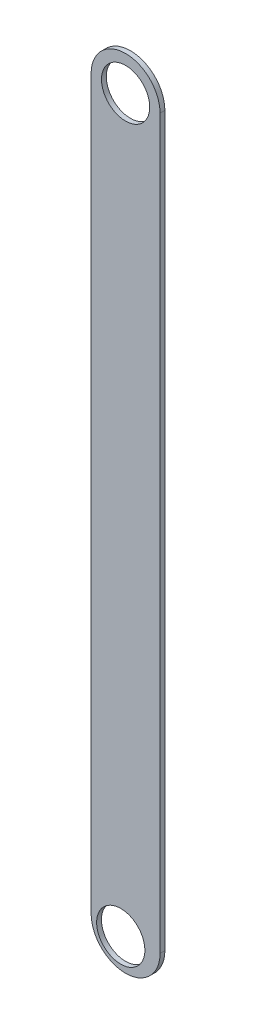
ISO-10303-21;
HEADER;
FILE_DESCRIPTION(('STEP AP214'),'2;1');
FILE_NAME('part.step','',(''),(''),'','','');
FILE_SCHEMA(('AUTOMOTIVE_DESIGN { 1 0 10303 214 1 1 1 1 }'));
ENDSEC;
DATA;
#1=APPLICATION_CONTEXT('core data for automotive mechanical design processes');
#2=APPLICATION_PROTOCOL_DEFINITION('international standard','automotive_design',2000,#1);
#3=PRODUCT_CONTEXT('',#1,'mechanical');
#4=PRODUCT('Part','Part','',(#3));
#5=PRODUCT_RELATED_PRODUCT_CATEGORY('part','',(#4));
#6=PRODUCT_DEFINITION_FORMATION('','',#4);
#7=PRODUCT_DEFINITION_CONTEXT('part definition',#1,'design');
#8=PRODUCT_DEFINITION('design','',#6,#7);
#9=PRODUCT_DEFINITION_SHAPE('','',#8);
#10=(LENGTH_UNIT() NAMED_UNIT(*) SI_UNIT(.MILLI.,.METRE.));
#11=(NAMED_UNIT(*) PLANE_ANGLE_UNIT() SI_UNIT($,.RADIAN.));
#12=(NAMED_UNIT(*) SI_UNIT($,.STERADIAN.) SOLID_ANGLE_UNIT());
#13=UNCERTAINTY_MEASURE_WITH_UNIT(LENGTH_MEASURE(1.E-05),#10,'distance_accuracy_value','');
#14=(GEOMETRIC_REPRESENTATION_CONTEXT(3) GLOBAL_UNCERTAINTY_ASSIGNED_CONTEXT((#13)) GLOBAL_UNIT_ASSIGNED_CONTEXT((#10,
#11,#12)) REPRESENTATION_CONTEXT('',''));
#15=CARTESIAN_POINT('',(0.,0.,0.));
#16=DIRECTION('',(0.,0.,1.));
#17=DIRECTION('',(1.,0.,0.));
#18=AXIS2_PLACEMENT_3D('',#15,#16,#17);
#19=CARTESIAN_POINT('',(134.32,-64.18,-0.045));
#20=DIRECTION('',(0.,0.,-1.));
#21=DIRECTION('',(0.,-1.,0.));
#22=AXIS2_PLACEMENT_3D('',#19,#20,#21);
#23=CYLINDRICAL_SURFACE('',#22,0.175);
#24=CARTESIAN_POINT('',(134.32,-64.18,-0.035));
#25=DIRECTION('',(0.,0.,-1.));
#26=DIRECTION('',(0.,-1.,0.));
#27=AXIS2_PLACEMENT_3D('',#24,#25,#26);
#28=CIRCLE('',#27,0.175);
#29=CARTESIAN_POINT('',(134.32,-64.355,-0.035));
#30=VERTEX_POINT('',#29);
#31=EDGE_CURVE('E124',#30,#30,#28,.T.);
#32=ORIENTED_EDGE('',*,*,#31,.T.);
#33=DIRECTION('',(0.,0.,1.));
#34=VECTOR('',#33,1.);
#35=CARTESIAN_POINT('',(134.32,-64.355,-0.045));
#36=LINE('',#35,#34);
#37=CARTESIAN_POINT('',(134.32,-64.355,0.));
#38=VERTEX_POINT('',#37);
#39=EDGE_CURVE('E11',#30,#38,#36,.T.);
#40=ORIENTED_EDGE('',*,*,#39,.T.);
#41=CARTESIAN_POINT('',(134.32,-64.18,0.));
#42=DIRECTION('',(0.,0.,-1.));
#43=DIRECTION('',(0.,-1.,0.));
#44=AXIS2_PLACEMENT_3D('',#41,#42,#43);
#45=CIRCLE('',#44,0.175);
#46=EDGE_CURVE('E122',#38,#38,#45,.T.);
#47=ORIENTED_EDGE('',*,*,#46,.F.);
#48=ORIENTED_EDGE('',*,*,#39,.F.);
#49=EDGE_LOOP('',(#32,#40,#47,#48));
#50=FACE_BOUND('',#49,.T.);
#51=ADVANCED_FACE('F17',(#50),#23,.F.);
#52=CARTESIAN_POINT('',(134.284877,-69.495123,-0.045));
#53=DIRECTION('',(0.,0.,-1.));
#54=DIRECTION('',(0.,-1.,0.));
#55=AXIS2_PLACEMENT_3D('',#52,#53,#54);
#56=CYLINDRICAL_SURFACE('',#55,0.175);
#57=CARTESIAN_POINT('',(134.284877,-69.495123,-0.035));
#58=DIRECTION('',(0.,0.,-1.));
#59=DIRECTION('',(0.,-1.,0.));
#60=AXIS2_PLACEMENT_3D('',#57,#58,#59);
#61=CIRCLE('',#60,0.175);
#62=CARTESIAN_POINT('',(134.284877,-69.670123,-0.035));
#63=VERTEX_POINT('',#62);
#64=EDGE_CURVE('E92',#63,#63,#61,.T.);
#65=ORIENTED_EDGE('',*,*,#64,.T.);
#66=DIRECTION('',(0.,0.,1.));
#67=VECTOR('',#66,1.);
#68=CARTESIAN_POINT('',(134.284877,-69.670123,-0.045));
#69=LINE('',#68,#67);
#70=CARTESIAN_POINT('',(134.284877,-69.670123,0.));
#71=VERTEX_POINT('',#70);
#72=EDGE_CURVE('E26',#63,#71,#69,.T.);
#73=ORIENTED_EDGE('',*,*,#72,.T.);
#74=CARTESIAN_POINT('',(134.284877,-69.495123,0.));
#75=DIRECTION('',(0.,0.,-1.));
#76=DIRECTION('',(0.,-1.,0.));
#77=AXIS2_PLACEMENT_3D('',#74,#75,#76);
#78=CIRCLE('',#77,0.175);
#79=EDGE_CURVE('E118',#71,#71,#78,.T.);
#80=ORIENTED_EDGE('',*,*,#79,.F.);
#81=ORIENTED_EDGE('',*,*,#72,.F.);
#82=EDGE_LOOP('',(#65,#73,#80,#81));
#83=FACE_BOUND('',#82,.T.);
#84=ADVANCED_FACE('F174',(#83),#56,.F.);
#85=CARTESIAN_POINT('',(134.57,-69.46,-0.035));
#86=DIRECTION('',(-1.,0.,0.));
#87=DIRECTION('',(0.,0.,1.));
#88=AXIS2_PLACEMENT_3D('',#85,#86,#87);
#89=PLANE('',#88);
#90=DIRECTION('',(0.,1.,0.));
#91=VECTOR('',#90,1.);
#92=CARTESIAN_POINT('',(134.57,-69.46,-0.035));
#93=LINE('',#92,#91);
#94=CARTESIAN_POINT('',(134.57,-69.46,-0.035));
#95=VERTEX_POINT('',#94);
#96=CARTESIAN_POINT('',(134.57,-64.18,-0.035));
#97=VERTEX_POINT('',#96);
#98=EDGE_CURVE('E80',#95,#97,#93,.T.);
#99=ORIENTED_EDGE('',*,*,#98,.T.);
#100=DIRECTION('',(0.,0.,1.));
#101=VECTOR('',#100,1.);
#102=CARTESIAN_POINT('',(134.57,-64.18,-0.035));
#103=LINE('',#102,#101);
#104=CARTESIAN_POINT('',(134.57,-64.18,0.));
#105=VERTEX_POINT('',#104);
#106=EDGE_CURVE('E108',#97,#105,#103,.T.);
#107=ORIENTED_EDGE('',*,*,#106,.T.);
#108=DIRECTION('',(0.,1.,0.));
#109=VECTOR('',#108,1.);
#110=CARTESIAN_POINT('',(134.57,-69.46,0.));
#111=LINE('',#110,#109);
#112=CARTESIAN_POINT('',(134.57,-69.46,0.));
#113=VERTEX_POINT('',#112);
#114=EDGE_CURVE('E98',#113,#105,#111,.T.);
#115=ORIENTED_EDGE('',*,*,#114,.F.);
#116=DIRECTION('',(0.,0.,1.));
#117=VECTOR('',#116,1.);
#118=CARTESIAN_POINT('',(134.57,-69.46,-0.035));
#119=LINE('',#118,#117);
#120=EDGE_CURVE('E96',#95,#113,#119,.T.);
#121=ORIENTED_EDGE('',*,*,#120,.F.);
#122=EDGE_LOOP('',(#99,#107,#115,#121));
#123=FACE_BOUND('',#122,.T.);
#124=ADVANCED_FACE('F97',(#123),#89,.F.);
#125=CARTESIAN_POINT('',(134.07,-64.18,0.));
#126=DIRECTION('',(0.,0.,1.));
#127=DIRECTION('',(1.,0.,0.));
#128=AXIS2_PLACEMENT_3D('',#125,#126,#127);
#129=PLANE('',#128);
#130=ORIENTED_EDGE('',*,*,#46,.T.);
#131=EDGE_LOOP('',(#130));
#132=FACE_BOUND('',#131,.T.);
#133=ORIENTED_EDGE('',*,*,#79,.T.);
#134=EDGE_LOOP('',(#133));
#135=FACE_BOUND('',#134,.T.);
#136=DIRECTION('',(0.,-1.,0.));
#137=VECTOR('',#136,1.);
#138=CARTESIAN_POINT('',(134.07,-64.18,0.));
#139=LINE('',#138,#137);
#140=CARTESIAN_POINT('',(134.07,-64.18,0.));
#141=VERTEX_POINT('',#140);
#142=CARTESIAN_POINT('',(134.07,-69.46,0.));
#143=VERTEX_POINT('',#142);
#144=EDGE_CURVE('E156',#141,#143,#139,.T.);
#145=ORIENTED_EDGE('',*,*,#144,.T.);
#146=CARTESIAN_POINT('',(134.32,-69.46,0.));
#147=DIRECTION('',(0.,0.,1.));
#148=DIRECTION('',(-1.,0.,0.));
#149=AXIS2_PLACEMENT_3D('',#146,#147,#148);
#150=CIRCLE('',#149,0.25);
#151=EDGE_CURVE('E93',#143,#113,#150,.T.);
#152=ORIENTED_EDGE('',*,*,#151,.T.);
#153=ORIENTED_EDGE('',*,*,#114,.T.);
#154=CARTESIAN_POINT('',(134.32,-64.18,0.));
#155=DIRECTION('',(0.,0.,1.));
#156=DIRECTION('',(1.,0.,0.));
#157=AXIS2_PLACEMENT_3D('',#154,#155,#156);
#158=CIRCLE('',#157,0.25);
#159=EDGE_CURVE('E114',#105,#141,#158,.T.);
#160=ORIENTED_EDGE('',*,*,#159,.T.);
#161=EDGE_LOOP('',(#145,#152,#153,#160));
#162=FACE_BOUND('',#161,.T.);
#163=ADVANCED_FACE('F171',(#132,#135,#162),#129,.T.);
#164=CARTESIAN_POINT('',(134.07,-64.18,-0.035));
#165=DIRECTION('',(0.,0.,1.));
#166=DIRECTION('',(1.,0.,0.));
#167=AXIS2_PLACEMENT_3D('',#164,#165,#166);
#168=PLANE('',#167);
#169=ORIENTED_EDGE('',*,*,#31,.F.);
#170=EDGE_LOOP('',(#169));
#171=FACE_BOUND('',#170,.T.);
#172=ORIENTED_EDGE('',*,*,#64,.F.);
#173=EDGE_LOOP('',(#172));
#174=FACE_BOUND('',#173,.T.);
#175=CARTESIAN_POINT('',(134.32,-64.18,-0.035));
#176=DIRECTION('',(0.,0.,1.));
#177=DIRECTION('',(1.,0.,0.));
#178=AXIS2_PLACEMENT_3D('',#175,#176,#177);
#179=CIRCLE('',#178,0.25);
#180=CARTESIAN_POINT('',(134.07,-64.18,-0.035));
#181=VERTEX_POINT('',#180);
#182=EDGE_CURVE('E87',#97,#181,#179,.T.);
#183=ORIENTED_EDGE('',*,*,#182,.F.);
#184=ORIENTED_EDGE('',*,*,#98,.F.);
#185=CARTESIAN_POINT('',(134.32,-69.46,-0.035));
#186=DIRECTION('',(0.,0.,1.));
#187=DIRECTION('',(-1.,0.,0.));
#188=AXIS2_PLACEMENT_3D('',#185,#186,#187);
#189=CIRCLE('',#188,0.25);
#190=CARTESIAN_POINT('',(134.07,-69.46,-0.035));
#191=VERTEX_POINT('',#190);
#192=EDGE_CURVE('E85',#191,#95,#189,.T.);
#193=ORIENTED_EDGE('',*,*,#192,.F.);
#194=DIRECTION('',(0.,-1.,0.));
#195=VECTOR('',#194,1.);
#196=CARTESIAN_POINT('',(134.07,-64.18,-0.035));
#197=LINE('',#196,#195);
#198=EDGE_CURVE('E180',#181,#191,#197,.T.);
#199=ORIENTED_EDGE('',*,*,#198,.F.);
#200=EDGE_LOOP('',(#183,#184,#193,#199));
#201=FACE_BOUND('',#200,.T.);
#202=ADVANCED_FACE('F82',(#171,#174,#201),#168,.F.);
#203=CARTESIAN_POINT('',(134.32,-69.46,-0.035));
#204=DIRECTION('',(0.,0.,-1.));
#205=DIRECTION('',(-1.,0.,0.));
#206=AXIS2_PLACEMENT_3D('',#203,#204,#205);
#207=CYLINDRICAL_SURFACE('',#206,0.25);
#208=ORIENTED_EDGE('',*,*,#192,.T.);
#209=ORIENTED_EDGE('',*,*,#120,.T.);
#210=ORIENTED_EDGE('',*,*,#151,.F.);
#211=DIRECTION('',(0.,0.,1.));
#212=VECTOR('',#211,1.);
#213=CARTESIAN_POINT('',(134.07,-69.46,-0.035));
#214=LINE('',#213,#212);
#215=EDGE_CURVE('E105',#191,#143,#214,.T.);
#216=ORIENTED_EDGE('',*,*,#215,.F.);
#217=EDGE_LOOP('',(#208,#209,#210,#216));
#218=FACE_BOUND('',#217,.T.);
#219=ADVANCED_FACE('F103',(#218),#207,.T.);
#220=CARTESIAN_POINT('',(134.32,-64.18,-0.035));
#221=DIRECTION('',(0.,0.,-1.));
#222=DIRECTION('',(1.,0.,0.));
#223=AXIS2_PLACEMENT_3D('',#220,#221,#222);
#224=CYLINDRICAL_SURFACE('',#223,0.25);
#225=ORIENTED_EDGE('',*,*,#182,.T.);
#226=DIRECTION('',(0.,0.,1.));
#227=VECTOR('',#226,1.);
#228=CARTESIAN_POINT('',(134.07,-64.18,-0.035));
#229=LINE('',#228,#227);
#230=EDGE_CURVE('E150',#181,#141,#229,.T.);
#231=ORIENTED_EDGE('',*,*,#230,.T.);
#232=ORIENTED_EDGE('',*,*,#159,.F.);
#233=ORIENTED_EDGE('',*,*,#106,.F.);
#234=EDGE_LOOP('',(#225,#231,#232,#233));
#235=FACE_BOUND('',#234,.T.);
#236=ADVANCED_FACE('F241',(#235),#224,.T.);
#237=CARTESIAN_POINT('',(134.07,-64.18,-0.035));
#238=DIRECTION('',(1.,0.,0.));
#239=DIRECTION('',(0.,1.,0.));
#240=AXIS2_PLACEMENT_3D('',#237,#238,#239);
#241=PLANE('',#240);
#242=ORIENTED_EDGE('',*,*,#198,.T.);
#243=ORIENTED_EDGE('',*,*,#215,.T.);
#244=ORIENTED_EDGE('',*,*,#144,.F.);
#245=ORIENTED_EDGE('',*,*,#230,.F.);
#246=EDGE_LOOP('',(#242,#243,#244,#245));
#247=FACE_BOUND('',#246,.T.);
#248=ADVANCED_FACE('F179',(#247),#241,.F.);
#249=CLOSED_SHELL('',(#51,#84,#124,#163,#202,#219,#236,#248));
#250=MANIFOLD_SOLID_BREP('B1',#249);
#251=ADVANCED_BREP_SHAPE_REPRESENTATION('',(#18,#250),#14);
#252=SHAPE_DEFINITION_REPRESENTATION(#9,#251);
ENDSEC;
END-ISO-10303-21;
